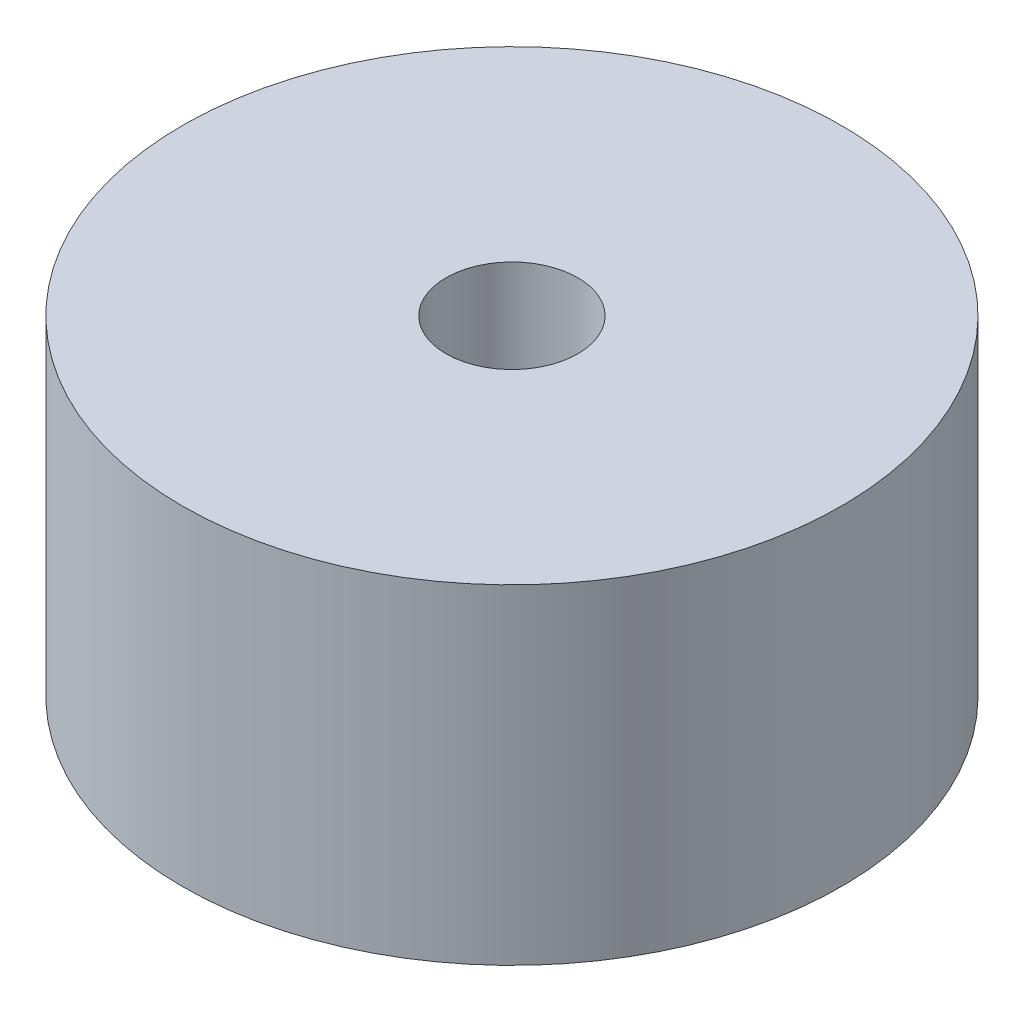
ISO-10303-21;
HEADER;
FILE_DESCRIPTION(('STEP AP214'),'2;1');
FILE_NAME('part.step','',(''),(''),'','','');
FILE_SCHEMA(('AUTOMOTIVE_DESIGN { 1 0 10303 214 1 1 1 1 }'));
ENDSEC;
DATA;
#1=APPLICATION_CONTEXT('core data for automotive mechanical design processes');
#2=APPLICATION_PROTOCOL_DEFINITION('international standard','automotive_design',2000,#1);
#3=PRODUCT_CONTEXT('',#1,'mechanical');
#4=PRODUCT('Part','Part','',(#3));
#5=PRODUCT_RELATED_PRODUCT_CATEGORY('part','',(#4));
#6=PRODUCT_DEFINITION_FORMATION('','',#4);
#7=PRODUCT_DEFINITION_CONTEXT('part definition',#1,'design');
#8=PRODUCT_DEFINITION('design','',#6,#7);
#9=PRODUCT_DEFINITION_SHAPE('','',#8);
#10=(LENGTH_UNIT() NAMED_UNIT(*) SI_UNIT(.MILLI.,.METRE.));
#11=(NAMED_UNIT(*) PLANE_ANGLE_UNIT() SI_UNIT($,.RADIAN.));
#12=(NAMED_UNIT(*) SI_UNIT($,.STERADIAN.) SOLID_ANGLE_UNIT());
#13=UNCERTAINTY_MEASURE_WITH_UNIT(LENGTH_MEASURE(1.E-05),#10,'distance_accuracy_value','');
#14=(GEOMETRIC_REPRESENTATION_CONTEXT(3) GLOBAL_UNCERTAINTY_ASSIGNED_CONTEXT((#13)) GLOBAL_UNIT_ASSIGNED_CONTEXT((#10,
#11,#12)) REPRESENTATION_CONTEXT('',''));
#15=CARTESIAN_POINT('',(0.,0.,0.));
#16=DIRECTION('',(0.,0.,1.));
#17=DIRECTION('',(1.,0.,0.));
#18=AXIS2_PLACEMENT_3D('',#15,#16,#17);
#19=CARTESIAN_POINT('',(0.,50.,0.));
#20=DIRECTION('',(0.,1.,0.));
#21=DIRECTION('',(0.,0.,1.));
#22=AXIS2_PLACEMENT_3D('',#19,#20,#21);
#23=PLANE('',#22);
#24=CARTESIAN_POINT('',(0.,50.,0.));
#25=DIRECTION('',(0.,1.,0.));
#26=DIRECTION('',(0.,0.,1.));
#27=AXIS2_PLACEMENT_3D('',#24,#25,#26);
#28=CIRCLE('',#27,50.);
#29=CARTESIAN_POINT('',(0.,50.,50.));
#30=VERTEX_POINT('',#29);
#31=EDGE_CURVE('E10',#30,#30,#28,.T.);
#32=ORIENTED_EDGE('',*,*,#31,.T.);
#33=EDGE_LOOP('',(#32));
#34=FACE_BOUND('',#33,.T.);
#35=CARTESIAN_POINT('',(0.,50.,0.));
#36=DIRECTION('',(0.,1.,0.));
#37=DIRECTION('',(0.,0.,1.));
#38=AXIS2_PLACEMENT_3D('',#35,#36,#37);
#39=CIRCLE('',#38,10.);
#40=CARTESIAN_POINT('',(0.,50.,10.));
#41=VERTEX_POINT('',#40);
#42=EDGE_CURVE('E56',#41,#41,#39,.T.);
#43=ORIENTED_EDGE('',*,*,#42,.F.);
#44=EDGE_LOOP('',(#43));
#45=FACE_BOUND('',#44,.T.);
#46=ADVANCED_FACE('F43',(#34,#45),#23,.T.);
#47=CARTESIAN_POINT('',(0.,0.,0.));
#48=DIRECTION('',(0.,1.,0.));
#49=DIRECTION('',(0.,0.,1.));
#50=AXIS2_PLACEMENT_3D('',#47,#48,#49);
#51=PLANE('',#50);
#52=CARTESIAN_POINT('',(0.,0.,0.));
#53=DIRECTION('',(0.,1.,0.));
#54=DIRECTION('',(0.,0.,1.));
#55=AXIS2_PLACEMENT_3D('',#52,#53,#54);
#56=CIRCLE('',#55,50.);
#57=CARTESIAN_POINT('',(0.,0.,50.));
#58=VERTEX_POINT('',#57);
#59=EDGE_CURVE('E47',#58,#58,#56,.T.);
#60=ORIENTED_EDGE('',*,*,#59,.F.);
#61=EDGE_LOOP('',(#60));
#62=FACE_BOUND('',#61,.T.);
#63=CARTESIAN_POINT('',(0.,0.,0.));
#64=DIRECTION('',(0.,1.,0.));
#65=DIRECTION('',(0.,0.,1.));
#66=AXIS2_PLACEMENT_3D('',#63,#64,#65);
#67=CIRCLE('',#66,10.);
#68=CARTESIAN_POINT('',(0.,0.,10.));
#69=VERTEX_POINT('',#68);
#70=EDGE_CURVE('E58',#69,#69,#67,.T.);
#71=ORIENTED_EDGE('',*,*,#70,.T.);
#72=EDGE_LOOP('',(#71));
#73=FACE_BOUND('',#72,.T.);
#74=ADVANCED_FACE('F70',(#62,#73),#51,.F.);
#75=CARTESIAN_POINT('',(0.,50.,0.));
#76=DIRECTION('',(0.,-1.,0.));
#77=DIRECTION('',(0.,0.,-1.));
#78=AXIS2_PLACEMENT_3D('',#75,#76,#77);
#79=CYLINDRICAL_SURFACE('',#78,50.);
#80=ORIENTED_EDGE('',*,*,#31,.F.);
#81=EDGE_LOOP('',(#80));
#82=FACE_BOUND('',#81,.T.);
#83=ORIENTED_EDGE('',*,*,#59,.T.);
#84=EDGE_LOOP('',(#83));
#85=FACE_BOUND('',#84,.T.);
#86=ADVANCED_FACE('F45',(#82,#85),#79,.T.);
#87=CARTESIAN_POINT('',(0.,50.,0.));
#88=DIRECTION('',(0.,-1.,0.));
#89=DIRECTION('',(0.,0.,-1.));
#90=AXIS2_PLACEMENT_3D('',#87,#88,#89);
#91=CYLINDRICAL_SURFACE('',#90,10.);
#92=ORIENTED_EDGE('',*,*,#42,.T.);
#93=EDGE_LOOP('',(#92));
#94=FACE_BOUND('',#93,.T.);
#95=ORIENTED_EDGE('',*,*,#70,.F.);
#96=EDGE_LOOP('',(#95));
#97=FACE_BOUND('',#96,.T.);
#98=ADVANCED_FACE('F66',(#94,#97),#91,.F.);
#99=CLOSED_SHELL('',(#46,#74,#86,#98));
#100=MANIFOLD_SOLID_BREP('B2',#99);
#101=ADVANCED_BREP_SHAPE_REPRESENTATION('',(#18,#100),#14);
#102=SHAPE_DEFINITION_REPRESENTATION(#9,#101);
ENDSEC;
END-ISO-10303-21;
